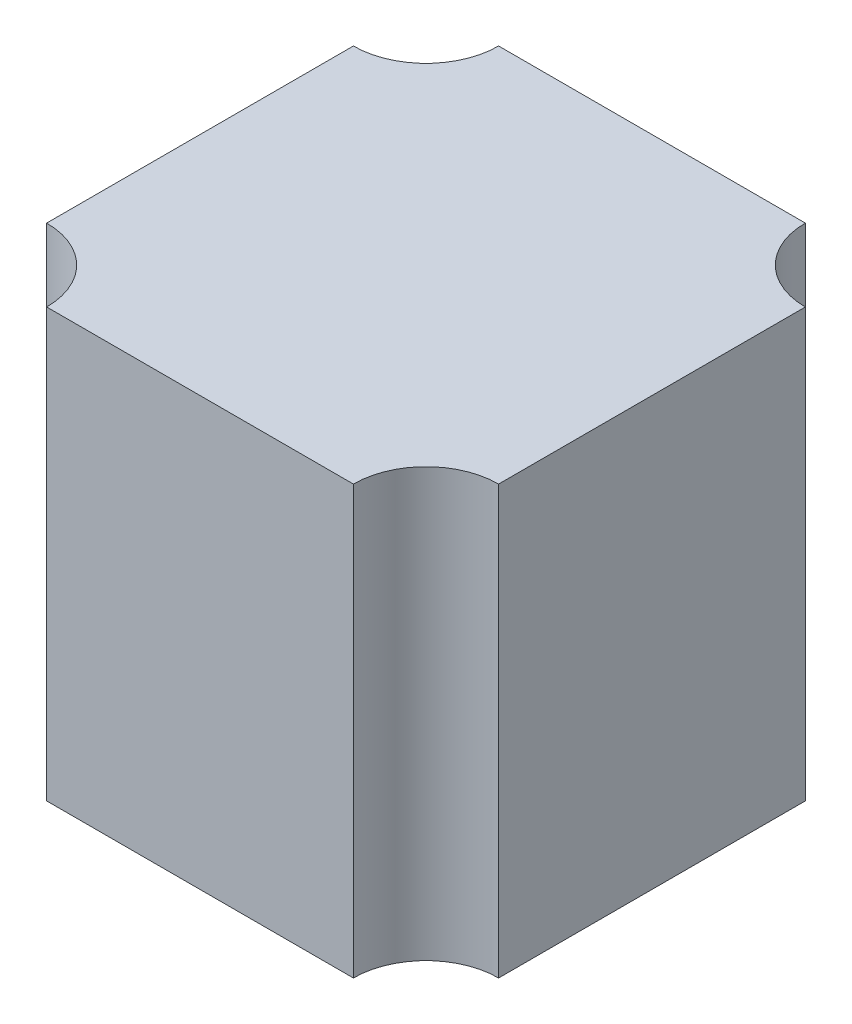
ISO-10303-21;
HEADER;
FILE_DESCRIPTION(('STEP AP214'),'2;1');
FILE_NAME('part.step','',(''),(''),'','','');
FILE_SCHEMA(('AUTOMOTIVE_DESIGN { 1 0 10303 214 1 1 1 1 }'));
ENDSEC;
DATA;
#1=APPLICATION_CONTEXT('core data for automotive mechanical design processes');
#2=APPLICATION_PROTOCOL_DEFINITION('international standard','automotive_design',2000,#1);
#3=PRODUCT_CONTEXT('',#1,'mechanical');
#4=PRODUCT('Part','Part','',(#3));
#5=PRODUCT_RELATED_PRODUCT_CATEGORY('part','',(#4));
#6=PRODUCT_DEFINITION_FORMATION('','',#4);
#7=PRODUCT_DEFINITION_CONTEXT('part definition',#1,'design');
#8=PRODUCT_DEFINITION('design','',#6,#7);
#9=PRODUCT_DEFINITION_SHAPE('','',#8);
#10=(LENGTH_UNIT() NAMED_UNIT(*) SI_UNIT(.MILLI.,.METRE.));
#11=(NAMED_UNIT(*) PLANE_ANGLE_UNIT() SI_UNIT($,.RADIAN.));
#12=(NAMED_UNIT(*) SI_UNIT($,.STERADIAN.) SOLID_ANGLE_UNIT());
#13=UNCERTAINTY_MEASURE_WITH_UNIT(LENGTH_MEASURE(1.E-05),#10,'distance_accuracy_value','');
#14=(GEOMETRIC_REPRESENTATION_CONTEXT(3) GLOBAL_UNCERTAINTY_ASSIGNED_CONTEXT((#13)) GLOBAL_UNIT_ASSIGNED_CONTEXT((#10,
#11,#12)) REPRESENTATION_CONTEXT('',''));
#15=CARTESIAN_POINT('',(0.,0.,0.));
#16=DIRECTION('',(0.,0.,1.));
#17=DIRECTION('',(1.,0.,0.));
#18=AXIS2_PLACEMENT_3D('',#15,#16,#17);
#19=CARTESIAN_POINT('',(28.,53.,-28.));
#20=DIRECTION('',(0.,-1.,0.));
#21=DIRECTION('',(0.,0.,-1.));
#22=AXIS2_PLACEMENT_3D('',#19,#20,#21);
#23=CYLINDRICAL_SURFACE('',#22,9.);
#24=CARTESIAN_POINT('',(28.,0.,-28.));
#25=DIRECTION('',(0.,-1.,0.));
#26=DIRECTION('',(0.,0.,1.));
#27=AXIS2_PLACEMENT_3D('',#24,#25,#26);
#28=CIRCLE('',#27,9.);
#29=CARTESIAN_POINT('',(28.,0.,-19.));
#30=VERTEX_POINT('',#29);
#31=CARTESIAN_POINT('',(19.,0.,-28.));
#32=VERTEX_POINT('',#31);
#33=EDGE_CURVE('E128',#30,#32,#28,.T.);
#34=ORIENTED_EDGE('',*,*,#33,.T.);
#35=DIRECTION('',(0.,-1.,0.));
#36=VECTOR('',#35,1.);
#37=CARTESIAN_POINT('',(19.,53.,-28.));
#38=LINE('',#37,#36);
#39=CARTESIAN_POINT('',(19.,53.,-28.));
#40=VERTEX_POINT('',#39);
#41=EDGE_CURVE('E11',#40,#32,#38,.T.);
#42=ORIENTED_EDGE('',*,*,#41,.F.);
#43=CARTESIAN_POINT('',(28.,53.,-28.));
#44=DIRECTION('',(0.,-1.,0.));
#45=DIRECTION('',(0.,0.,1.));
#46=AXIS2_PLACEMENT_3D('',#43,#44,#45);
#47=CIRCLE('',#46,9.);
#48=CARTESIAN_POINT('',(28.,53.,-19.));
#49=VERTEX_POINT('',#48);
#50=EDGE_CURVE('E142',#49,#40,#47,.T.);
#51=ORIENTED_EDGE('',*,*,#50,.F.);
#52=DIRECTION('',(0.,-1.,0.));
#53=VECTOR('',#52,1.);
#54=CARTESIAN_POINT('',(28.,53.,-19.));
#55=LINE('',#54,#53);
#56=EDGE_CURVE('E124',#49,#30,#55,.T.);
#57=ORIENTED_EDGE('',*,*,#56,.T.);
#58=EDGE_LOOP('',(#34,#42,#51,#57));
#59=FACE_BOUND('',#58,.T.);
#60=ADVANCED_FACE('F32',(#59),#23,.F.);
#61=CARTESIAN_POINT('',(-19.,53.,-28.));
#62=DIRECTION('',(0.,0.,1.));
#63=DIRECTION('',(1.,0.,0.));
#64=AXIS2_PLACEMENT_3D('',#61,#62,#63);
#65=PLANE('',#64);
#66=DIRECTION('',(-1.,0.,0.));
#67=VECTOR('',#66,1.);
#68=CARTESIAN_POINT('',(-19.,0.,-28.));
#69=LINE('',#68,#67);
#70=CARTESIAN_POINT('',(-19.,0.,-28.));
#71=VERTEX_POINT('',#70);
#72=EDGE_CURVE('E131',#32,#71,#69,.T.);
#73=ORIENTED_EDGE('',*,*,#72,.T.);
#74=DIRECTION('',(0.,-1.,0.));
#75=VECTOR('',#74,1.);
#76=CARTESIAN_POINT('',(-19.,53.,-28.));
#77=LINE('',#76,#75);
#78=CARTESIAN_POINT('',(-19.,53.,-28.));
#79=VERTEX_POINT('',#78);
#80=EDGE_CURVE('E40',#79,#71,#77,.T.);
#81=ORIENTED_EDGE('',*,*,#80,.F.);
#82=DIRECTION('',(-1.,0.,0.));
#83=VECTOR('',#82,1.);
#84=CARTESIAN_POINT('',(-19.,53.,-28.));
#85=LINE('',#84,#83);
#86=EDGE_CURVE('E91',#40,#79,#85,.T.);
#87=ORIENTED_EDGE('',*,*,#86,.F.);
#88=ORIENTED_EDGE('',*,*,#41,.T.);
#89=EDGE_LOOP('',(#73,#81,#87,#88));
#90=FACE_BOUND('',#89,.T.);
#91=ADVANCED_FACE('F177',(#90),#65,.F.);
#92=CARTESIAN_POINT('',(-28.,53.,-28.));
#93=DIRECTION('',(0.,-1.,0.));
#94=DIRECTION('',(0.,0.,-1.));
#95=AXIS2_PLACEMENT_3D('',#92,#93,#94);
#96=CYLINDRICAL_SURFACE('',#95,9.);
#97=CARTESIAN_POINT('',(-28.,0.,-28.));
#98=DIRECTION('',(0.,-1.,0.));
#99=DIRECTION('',(0.,0.,1.));
#100=AXIS2_PLACEMENT_3D('',#97,#98,#99);
#101=CIRCLE('',#100,9.);
#102=CARTESIAN_POINT('',(-28.,0.,-19.));
#103=VERTEX_POINT('',#102);
#104=EDGE_CURVE('E133',#71,#103,#101,.T.);
#105=ORIENTED_EDGE('',*,*,#104,.T.);
#106=DIRECTION('',(0.,-1.,0.));
#107=VECTOR('',#106,1.);
#108=CARTESIAN_POINT('',(-28.,53.,-19.));
#109=LINE('',#108,#107);
#110=CARTESIAN_POINT('',(-28.,53.,-19.));
#111=VERTEX_POINT('',#110);
#112=EDGE_CURVE('E149',#111,#103,#109,.T.);
#113=ORIENTED_EDGE('',*,*,#112,.F.);
#114=CARTESIAN_POINT('',(-28.,53.,-28.));
#115=DIRECTION('',(0.,-1.,0.));
#116=DIRECTION('',(0.,0.,1.));
#117=AXIS2_PLACEMENT_3D('',#114,#115,#116);
#118=CIRCLE('',#117,9.);
#119=EDGE_CURVE('E157',#79,#111,#118,.T.);
#120=ORIENTED_EDGE('',*,*,#119,.F.);
#121=ORIENTED_EDGE('',*,*,#80,.T.);
#122=EDGE_LOOP('',(#105,#113,#120,#121));
#123=FACE_BOUND('',#122,.T.);
#124=ADVANCED_FACE('F155',(#123),#96,.F.);
#125=CARTESIAN_POINT('',(-28.,53.,-19.));
#126=DIRECTION('',(1.,0.,0.));
#127=DIRECTION('',(0.,0.,-1.));
#128=AXIS2_PLACEMENT_3D('',#125,#126,#127);
#129=PLANE('',#128);
#130=DIRECTION('',(0.,0.,1.));
#131=VECTOR('',#130,1.);
#132=CARTESIAN_POINT('',(-28.,0.,-19.));
#133=LINE('',#132,#131);
#134=CARTESIAN_POINT('',(-28.,0.,19.));
#135=VERTEX_POINT('',#134);
#136=EDGE_CURVE('E135',#103,#135,#133,.T.);
#137=ORIENTED_EDGE('',*,*,#136,.T.);
#138=DIRECTION('',(0.,-1.,0.));
#139=VECTOR('',#138,1.);
#140=CARTESIAN_POINT('',(-28.,53.,19.));
#141=LINE('',#140,#139);
#142=CARTESIAN_POINT('',(-28.,53.,19.));
#143=VERTEX_POINT('',#142);
#144=EDGE_CURVE('E146',#143,#135,#141,.T.);
#145=ORIENTED_EDGE('',*,*,#144,.F.);
#146=DIRECTION('',(0.,0.,1.));
#147=VECTOR('',#146,1.);
#148=CARTESIAN_POINT('',(-28.,53.,-19.));
#149=LINE('',#148,#147);
#150=EDGE_CURVE('E169',#111,#143,#149,.T.);
#151=ORIENTED_EDGE('',*,*,#150,.F.);
#152=ORIENTED_EDGE('',*,*,#112,.T.);
#153=EDGE_LOOP('',(#137,#145,#151,#152));
#154=FACE_BOUND('',#153,.T.);
#155=ADVANCED_FACE('F165',(#154),#129,.F.);
#156=CARTESIAN_POINT('',(-28.,53.,28.));
#157=DIRECTION('',(0.,-1.,0.));
#158=DIRECTION('',(0.,0.,-1.));
#159=AXIS2_PLACEMENT_3D('',#156,#157,#158);
#160=CYLINDRICAL_SURFACE('',#159,9.);
#161=CARTESIAN_POINT('',(-28.,0.,28.));
#162=DIRECTION('',(0.,-1.,0.));
#163=DIRECTION('',(0.,0.,1.));
#164=AXIS2_PLACEMENT_3D('',#161,#162,#163);
#165=CIRCLE('',#164,9.);
#166=CARTESIAN_POINT('',(-19.,0.,28.));
#167=VERTEX_POINT('',#166);
#168=EDGE_CURVE('E137',#135,#167,#165,.T.);
#169=ORIENTED_EDGE('',*,*,#168,.T.);
#170=DIRECTION('',(0.,-1.,0.));
#171=VECTOR('',#170,1.);
#172=CARTESIAN_POINT('',(-19.,53.,28.));
#173=LINE('',#172,#171);
#174=CARTESIAN_POINT('',(-19.,53.,28.));
#175=VERTEX_POINT('',#174);
#176=EDGE_CURVE('E119',#175,#167,#173,.T.);
#177=ORIENTED_EDGE('',*,*,#176,.F.);
#178=CARTESIAN_POINT('',(-28.,53.,28.));
#179=DIRECTION('',(0.,-1.,0.));
#180=DIRECTION('',(0.,0.,1.));
#181=AXIS2_PLACEMENT_3D('',#178,#179,#180);
#182=CIRCLE('',#181,9.);
#183=EDGE_CURVE('E110',#143,#175,#182,.T.);
#184=ORIENTED_EDGE('',*,*,#183,.F.);
#185=ORIENTED_EDGE('',*,*,#144,.T.);
#186=EDGE_LOOP('',(#169,#177,#184,#185));
#187=FACE_BOUND('',#186,.T.);
#188=ADVANCED_FACE('F168',(#187),#160,.F.);
#189=CARTESIAN_POINT('',(-19.,53.,28.));
#190=DIRECTION('',(0.,0.,-1.));
#191=DIRECTION('',(-1.,0.,0.));
#192=AXIS2_PLACEMENT_3D('',#189,#190,#191);
#193=PLANE('',#192);
#194=DIRECTION('',(1.,0.,0.));
#195=VECTOR('',#194,1.);
#196=CARTESIAN_POINT('',(-19.,0.,28.));
#197=LINE('',#196,#195);
#198=CARTESIAN_POINT('',(19.,0.,28.));
#199=VERTEX_POINT('',#198);
#200=EDGE_CURVE('E118',#167,#199,#197,.T.);
#201=ORIENTED_EDGE('',*,*,#200,.T.);
#202=DIRECTION('',(0.,-1.,0.));
#203=VECTOR('',#202,1.);
#204=CARTESIAN_POINT('',(19.,53.,28.));
#205=LINE('',#204,#203);
#206=CARTESIAN_POINT('',(19.,53.,28.));
#207=VERTEX_POINT('',#206);
#208=EDGE_CURVE('E115',#207,#199,#205,.T.);
#209=ORIENTED_EDGE('',*,*,#208,.F.);
#210=DIRECTION('',(1.,0.,0.));
#211=VECTOR('',#210,1.);
#212=CARTESIAN_POINT('',(-19.,53.,28.));
#213=LINE('',#212,#211);
#214=EDGE_CURVE('E104',#175,#207,#213,.T.);
#215=ORIENTED_EDGE('',*,*,#214,.F.);
#216=ORIENTED_EDGE('',*,*,#176,.T.);
#217=EDGE_LOOP('',(#201,#209,#215,#216));
#218=FACE_BOUND('',#217,.T.);
#219=ADVANCED_FACE('F116',(#218),#193,.F.);
#220=CARTESIAN_POINT('',(28.,53.,28.));
#221=DIRECTION('',(0.,-1.,0.));
#222=DIRECTION('',(0.,0.,-1.));
#223=AXIS2_PLACEMENT_3D('',#220,#221,#222);
#224=CYLINDRICAL_SURFACE('',#223,9.);
#225=CARTESIAN_POINT('',(28.,0.,28.));
#226=DIRECTION('',(0.,-1.,0.));
#227=DIRECTION('',(0.,0.,1.));
#228=AXIS2_PLACEMENT_3D('',#225,#226,#227);
#229=CIRCLE('',#228,9.);
#230=CARTESIAN_POINT('',(28.,0.,19.));
#231=VERTEX_POINT('',#230);
#232=EDGE_CURVE('E77',#199,#231,#229,.T.);
#233=ORIENTED_EDGE('',*,*,#232,.T.);
#234=DIRECTION('',(0.,-1.,0.));
#235=VECTOR('',#234,1.);
#236=CARTESIAN_POINT('',(28.,53.,19.));
#237=LINE('',#236,#235);
#238=CARTESIAN_POINT('',(28.,53.,19.));
#239=VERTEX_POINT('',#238);
#240=EDGE_CURVE('E120',#239,#231,#237,.T.);
#241=ORIENTED_EDGE('',*,*,#240,.F.);
#242=CARTESIAN_POINT('',(28.,53.,28.));
#243=DIRECTION('',(0.,-1.,0.));
#244=DIRECTION('',(0.,0.,1.));
#245=AXIS2_PLACEMENT_3D('',#242,#243,#244);
#246=CIRCLE('',#245,9.);
#247=EDGE_CURVE('E108',#207,#239,#246,.T.);
#248=ORIENTED_EDGE('',*,*,#247,.F.);
#249=ORIENTED_EDGE('',*,*,#208,.T.);
#250=EDGE_LOOP('',(#233,#241,#248,#249));
#251=FACE_BOUND('',#250,.T.);
#252=ADVANCED_FACE('F122',(#251),#224,.F.);
#253=CARTESIAN_POINT('',(28.,53.,-19.));
#254=DIRECTION('',(-1.,0.,0.));
#255=DIRECTION('',(0.,0.,1.));
#256=AXIS2_PLACEMENT_3D('',#253,#254,#255);
#257=PLANE('',#256);
#258=DIRECTION('',(0.,0.,-1.));
#259=VECTOR('',#258,1.);
#260=CARTESIAN_POINT('',(28.,0.,-19.));
#261=LINE('',#260,#259);
#262=EDGE_CURVE('E83',#231,#30,#261,.T.);
#263=ORIENTED_EDGE('',*,*,#262,.T.);
#264=ORIENTED_EDGE('',*,*,#56,.F.);
#265=DIRECTION('',(0.,0.,-1.));
#266=VECTOR('',#265,1.);
#267=CARTESIAN_POINT('',(28.,53.,-19.));
#268=LINE('',#267,#266);
#269=EDGE_CURVE('E48',#239,#49,#268,.T.);
#270=ORIENTED_EDGE('',*,*,#269,.F.);
#271=ORIENTED_EDGE('',*,*,#240,.T.);
#272=EDGE_LOOP('',(#263,#264,#270,#271));
#273=FACE_BOUND('',#272,.T.);
#274=ADVANCED_FACE('F193',(#273),#257,.F.);
#275=CARTESIAN_POINT('',(28.,53.,-28.));
#276=DIRECTION('',(0.,1.,0.));
#277=DIRECTION('',(0.,0.,1.));
#278=AXIS2_PLACEMENT_3D('',#275,#276,#277);
#279=PLANE('',#278);
#280=ORIENTED_EDGE('',*,*,#50,.T.);
#281=ORIENTED_EDGE('',*,*,#86,.T.);
#282=ORIENTED_EDGE('',*,*,#119,.T.);
#283=ORIENTED_EDGE('',*,*,#150,.T.);
#284=ORIENTED_EDGE('',*,*,#183,.T.);
#285=ORIENTED_EDGE('',*,*,#214,.T.);
#286=ORIENTED_EDGE('',*,*,#247,.T.);
#287=ORIENTED_EDGE('',*,*,#269,.T.);
#288=EDGE_LOOP('',(#280,#281,#282,#283,#284,#285,#286,#287));
#289=FACE_BOUND('',#288,.T.);
#290=ADVANCED_FACE('F106',(#289),#279,.T.);
#291=CARTESIAN_POINT('',(28.,0.,-28.));
#292=DIRECTION('',(0.,1.,0.));
#293=DIRECTION('',(0.,0.,1.));
#294=AXIS2_PLACEMENT_3D('',#291,#292,#293);
#295=PLANE('',#294);
#296=ORIENTED_EDGE('',*,*,#33,.F.);
#297=ORIENTED_EDGE('',*,*,#262,.F.);
#298=ORIENTED_EDGE('',*,*,#232,.F.);
#299=ORIENTED_EDGE('',*,*,#200,.F.);
#300=ORIENTED_EDGE('',*,*,#168,.F.);
#301=ORIENTED_EDGE('',*,*,#136,.F.);
#302=ORIENTED_EDGE('',*,*,#104,.F.);
#303=ORIENTED_EDGE('',*,*,#72,.F.);
#304=EDGE_LOOP('',(#296,#297,#298,#299,#300,#301,#302,#303));
#305=FACE_BOUND('',#304,.T.);
#306=ADVANCED_FACE('F161',(#305),#295,.F.);
#307=CLOSED_SHELL('',(#60,#91,#124,#155,#188,#219,#252,#274,#290,#306));
#308=MANIFOLD_SOLID_BREP('B2',#307);
#309=ADVANCED_BREP_SHAPE_REPRESENTATION('',(#18,#308),#14);
#310=SHAPE_DEFINITION_REPRESENTATION(#9,#309);
ENDSEC;
END-ISO-10303-21;
